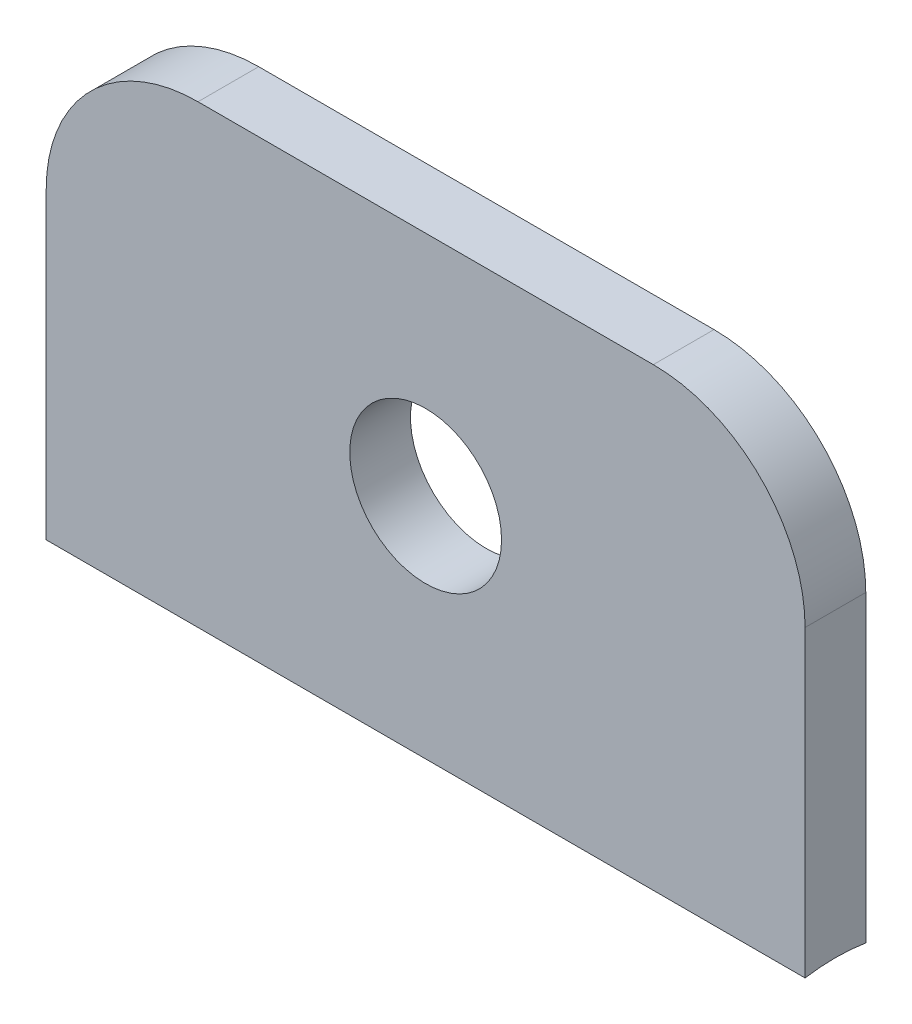
ISO-10303-21;
HEADER;
FILE_DESCRIPTION(('STEP AP214'),'2;1');
FILE_NAME('part.step','',(''),(''),'','','');
FILE_SCHEMA(('AUTOMOTIVE_DESIGN { 1 0 10303 214 1 1 1 1 }'));
ENDSEC;
DATA;
#1=APPLICATION_CONTEXT('core data for automotive mechanical design processes');
#2=APPLICATION_PROTOCOL_DEFINITION('international standard','automotive_design',2000,#1);
#3=PRODUCT_CONTEXT('',#1,'mechanical');
#4=PRODUCT('Part','Part','',(#3));
#5=PRODUCT_RELATED_PRODUCT_CATEGORY('part','',(#4));
#6=PRODUCT_DEFINITION_FORMATION('','',#4);
#7=PRODUCT_DEFINITION_CONTEXT('part definition',#1,'design');
#8=PRODUCT_DEFINITION('design','',#6,#7);
#9=PRODUCT_DEFINITION_SHAPE('','',#8);
#10=(LENGTH_UNIT() NAMED_UNIT(*) SI_UNIT(.MILLI.,.METRE.));
#11=(NAMED_UNIT(*) PLANE_ANGLE_UNIT() SI_UNIT($,.RADIAN.));
#12=(NAMED_UNIT(*) SI_UNIT($,.STERADIAN.) SOLID_ANGLE_UNIT());
#13=UNCERTAINTY_MEASURE_WITH_UNIT(LENGTH_MEASURE(1.E-05),#10,'distance_accuracy_value','');
#14=(GEOMETRIC_REPRESENTATION_CONTEXT(3) GLOBAL_UNCERTAINTY_ASSIGNED_CONTEXT((#13)) GLOBAL_UNIT_ASSIGNED_CONTEXT((#10,
#11,#12)) REPRESENTATION_CONTEXT('',''));
#15=CARTESIAN_POINT('',(0.,0.,0.));
#16=DIRECTION('',(0.,0.,1.));
#17=DIRECTION('',(1.,0.,0.));
#18=AXIS2_PLACEMENT_3D('',#15,#16,#17);
#19=CARTESIAN_POINT('',(-15.,5.,4.));
#20=DIRECTION('',(0.,0.,1.));
#21=DIRECTION('',(1.,0.,0.));
#22=AXIS2_PLACEMENT_3D('',#19,#20,#21);
#23=PLANE('',#22);
#24=DIRECTION('',(0.,1.,0.));
#25=VECTOR('',#24,1.);
#26=CARTESIAN_POINT('',(25.,4.99999999999993,4.));
#27=LINE('',#26,#25);
#28=CARTESIAN_POINT('',(25.,-15.,4.));
#29=VERTEX_POINT('',#28);
#30=CARTESIAN_POINT('',(25.,4.99999999999993,4.));
#31=VERTEX_POINT('',#30);
#32=EDGE_CURVE('E112',#29,#31,#27,.T.);
#33=ORIENTED_EDGE('',*,*,#32,.T.);
#34=CARTESIAN_POINT('',(15.,5.,4.));
#35=DIRECTION('',(0.,0.,1.));
#36=DIRECTION('',(-1.,0.,0.));
#37=AXIS2_PLACEMENT_3D('',#34,#35,#36);
#38=CIRCLE('',#37,10.);
#39=CARTESIAN_POINT('',(14.9999999999999,15.,4.));
#40=VERTEX_POINT('',#39);
#41=EDGE_CURVE('E91',#31,#40,#38,.T.);
#42=ORIENTED_EDGE('',*,*,#41,.T.);
#43=DIRECTION('',(-1.,0.,0.));
#44=VECTOR('',#43,1.);
#45=CARTESIAN_POINT('',(-14.9999999999999,15.,4.));
#46=LINE('',#45,#44);
#47=CARTESIAN_POINT('',(-14.9999999999999,15.,4.));
#48=VERTEX_POINT('',#47);
#49=EDGE_CURVE('E119',#40,#48,#46,.T.);
#50=ORIENTED_EDGE('',*,*,#49,.T.);
#51=CARTESIAN_POINT('',(-15.,5.,4.));
#52=DIRECTION('',(0.,0.,1.));
#53=DIRECTION('',(1.,0.,0.));
#54=AXIS2_PLACEMENT_3D('',#51,#52,#53);
#55=CIRCLE('',#54,10.);
#56=CARTESIAN_POINT('',(-25.,4.99999999999993,4.));
#57=VERTEX_POINT('',#56);
#58=EDGE_CURVE('E56',#48,#57,#55,.T.);
#59=ORIENTED_EDGE('',*,*,#58,.T.);
#60=DIRECTION('',(0.,-1.,0.));
#61=VECTOR('',#60,1.);
#62=CARTESIAN_POINT('',(-25.,4.99999999999993,4.));
#63=LINE('',#62,#61);
#64=CARTESIAN_POINT('',(-25.,-15.,4.));
#65=VERTEX_POINT('',#64);
#66=EDGE_CURVE('E115',#57,#65,#63,.T.);
#67=ORIENTED_EDGE('',*,*,#66,.T.);
#68=DIRECTION('',(1.,0.,0.));
#69=VECTOR('',#68,1.);
#70=CARTESIAN_POINT('',(-25.,-15.,4.));
#71=LINE('',#70,#69);
#72=EDGE_CURVE('E103',#65,#29,#71,.T.);
#73=ORIENTED_EDGE('',*,*,#72,.T.);
#74=EDGE_LOOP('',(#33,#42,#50,#59,#67,#73));
#75=FACE_BOUND('',#74,.T.);
#76=CARTESIAN_POINT('',(0.,0.,4.));
#77=DIRECTION('',(0.,0.,1.));
#78=DIRECTION('',(1.,0.,0.));
#79=AXIS2_PLACEMENT_3D('',#76,#77,#78);
#80=CIRCLE('',#79,5.);
#81=CARTESIAN_POINT('',(5.,0.,4.));
#82=VERTEX_POINT('',#81);
#83=EDGE_CURVE('E133',#82,#82,#80,.T.);
#84=ORIENTED_EDGE('',*,*,#83,.F.);
#85=EDGE_LOOP('',(#84));
#86=FACE_BOUND('',#85,.T.);
#87=ADVANCED_FACE('F39',(#75,#86),#23,.T.);
#88=CARTESIAN_POINT('',(-15.,5.,0.));
#89=DIRECTION('',(0.,0.,1.));
#90=DIRECTION('',(1.,0.,0.));
#91=AXIS2_PLACEMENT_3D('',#88,#89,#90);
#92=PLANE('',#91);
#93=DIRECTION('',(0.,1.,0.));
#94=VECTOR('',#93,1.);
#95=CARTESIAN_POINT('',(25.,4.99999999999993,0.));
#96=LINE('',#95,#94);
#97=CARTESIAN_POINT('',(25.,-15.,0.));
#98=VERTEX_POINT('',#97);
#99=CARTESIAN_POINT('',(25.,4.99999999999993,0.));
#100=VERTEX_POINT('',#99);
#101=EDGE_CURVE('E130',#98,#100,#96,.T.);
#102=ORIENTED_EDGE('',*,*,#101,.F.);
#103=DIRECTION('',(1.,0.,0.));
#104=VECTOR('',#103,1.);
#105=CARTESIAN_POINT('',(-25.,-15.,0.));
#106=LINE('',#105,#104);
#107=CARTESIAN_POINT('',(-25.,-15.,0.));
#108=VERTEX_POINT('',#107);
#109=EDGE_CURVE('E105',#108,#98,#106,.T.);
#110=ORIENTED_EDGE('',*,*,#109,.F.);
#111=DIRECTION('',(0.,-1.,0.));
#112=VECTOR('',#111,1.);
#113=CARTESIAN_POINT('',(-25.,4.99999999999993,0.));
#114=LINE('',#113,#112);
#115=CARTESIAN_POINT('',(-25.,4.99999999999993,0.));
#116=VERTEX_POINT('',#115);
#117=EDGE_CURVE('E121',#116,#108,#114,.T.);
#118=ORIENTED_EDGE('',*,*,#117,.F.);
#119=CARTESIAN_POINT('',(-15.,5.,0.));
#120=DIRECTION('',(0.,0.,1.));
#121=DIRECTION('',(1.,0.,0.));
#122=AXIS2_PLACEMENT_3D('',#119,#120,#121);
#123=CIRCLE('',#122,10.);
#124=CARTESIAN_POINT('',(-14.9999999999999,15.,0.));
#125=VERTEX_POINT('',#124);
#126=EDGE_CURVE('E76',#125,#116,#123,.T.);
#127=ORIENTED_EDGE('',*,*,#126,.F.);
#128=DIRECTION('',(-1.,0.,0.));
#129=VECTOR('',#128,1.);
#130=CARTESIAN_POINT('',(-14.9999999999999,15.,0.));
#131=LINE('',#130,#129);
#132=CARTESIAN_POINT('',(14.9999999999999,15.,0.));
#133=VERTEX_POINT('',#132);
#134=EDGE_CURVE('E135',#133,#125,#131,.T.);
#135=ORIENTED_EDGE('',*,*,#134,.F.);
#136=CARTESIAN_POINT('',(15.,5.,0.));
#137=DIRECTION('',(0.,0.,1.));
#138=DIRECTION('',(-1.,0.,0.));
#139=AXIS2_PLACEMENT_3D('',#136,#137,#138);
#140=CIRCLE('',#139,10.);
#141=EDGE_CURVE('E132',#100,#133,#140,.T.);
#142=ORIENTED_EDGE('',*,*,#141,.F.);
#143=EDGE_LOOP('',(#102,#110,#118,#127,#135,#142));
#144=FACE_BOUND('',#143,.T.);
#145=CARTESIAN_POINT('',(0.,0.,0.));
#146=DIRECTION('',(0.,0.,1.));
#147=DIRECTION('',(1.,0.,0.));
#148=AXIS2_PLACEMENT_3D('',#145,#146,#147);
#149=CIRCLE('',#148,5.);
#150=CARTESIAN_POINT('',(5.,0.,0.));
#151=VERTEX_POINT('',#150);
#152=EDGE_CURVE('E124',#151,#151,#149,.T.);
#153=ORIENTED_EDGE('',*,*,#152,.T.);
#154=EDGE_LOOP('',(#153));
#155=FACE_BOUND('',#154,.T.);
#156=ADVANCED_FACE('F148',(#144,#155),#92,.F.);
#157=CARTESIAN_POINT('',(25.,4.99999999999993,4.));
#158=DIRECTION('',(-1.,0.,0.));
#159=DIRECTION('',(0.,-1.,0.));
#160=AXIS2_PLACEMENT_3D('',#157,#158,#159);
#161=PLANE('',#160);
#162=ORIENTED_EDGE('',*,*,#32,.F.);
#163=CARTESIAN_POINT('',(25.,-27.5415310070182,2.));
#164=DIRECTION('',(1.,0.,0.));
#165=DIRECTION('',(0.,-1.,0.));
#166=AXIS2_PLACEMENT_3D('',#163,#164,#165);
#167=CIRCLE('',#166,12.7);
#168=EDGE_CURVE('E100',#98,#29,#167,.T.);
#169=ORIENTED_EDGE('',*,*,#168,.F.);
#170=ORIENTED_EDGE('',*,*,#101,.T.);
#171=DIRECTION('',(0.,0.,-1.));
#172=VECTOR('',#171,1.);
#173=CARTESIAN_POINT('',(25.,4.99999999999993,4.));
#174=LINE('',#173,#172);
#175=EDGE_CURVE('E11',#31,#100,#174,.T.);
#176=ORIENTED_EDGE('',*,*,#175,.F.);
#177=EDGE_LOOP('',(#162,#169,#170,#176));
#178=FACE_BOUND('',#177,.T.);
#179=ADVANCED_FACE('F41',(#178),#161,.F.);
#180=CARTESIAN_POINT('',(15.,5.,4.));
#181=DIRECTION('',(0.,0.,-1.));
#182=DIRECTION('',(-1.,0.,0.));
#183=AXIS2_PLACEMENT_3D('',#180,#181,#182);
#184=CYLINDRICAL_SURFACE('',#183,10.);
#185=ORIENTED_EDGE('',*,*,#141,.T.);
#186=DIRECTION('',(0.,0.,-1.));
#187=VECTOR('',#186,1.);
#188=CARTESIAN_POINT('',(14.9999999999999,15.,4.));
#189=LINE('',#188,#187);
#190=EDGE_CURVE('E48',#40,#133,#189,.T.);
#191=ORIENTED_EDGE('',*,*,#190,.F.);
#192=ORIENTED_EDGE('',*,*,#41,.F.);
#193=ORIENTED_EDGE('',*,*,#175,.T.);
#194=EDGE_LOOP('',(#185,#191,#192,#193));
#195=FACE_BOUND('',#194,.T.);
#196=ADVANCED_FACE('F162',(#195),#184,.T.);
#197=CARTESIAN_POINT('',(-14.9999999999999,15.,4.));
#198=DIRECTION('',(0.,-1.,0.));
#199=DIRECTION('',(0.,0.,-1.));
#200=AXIS2_PLACEMENT_3D('',#197,#198,#199);
#201=PLANE('',#200);
#202=ORIENTED_EDGE('',*,*,#134,.T.);
#203=DIRECTION('',(0.,0.,-1.));
#204=VECTOR('',#203,1.);
#205=CARTESIAN_POINT('',(-14.9999999999999,15.,4.));
#206=LINE('',#205,#204);
#207=EDGE_CURVE('E140',#48,#125,#206,.T.);
#208=ORIENTED_EDGE('',*,*,#207,.F.);
#209=ORIENTED_EDGE('',*,*,#49,.F.);
#210=ORIENTED_EDGE('',*,*,#190,.T.);
#211=EDGE_LOOP('',(#202,#208,#209,#210));
#212=FACE_BOUND('',#211,.T.);
#213=ADVANCED_FACE('F145',(#212),#201,.F.);
#214=CARTESIAN_POINT('',(-15.,5.,4.));
#215=DIRECTION('',(0.,0.,-1.));
#216=DIRECTION('',(-1.,0.,0.));
#217=AXIS2_PLACEMENT_3D('',#214,#215,#216);
#218=CYLINDRICAL_SURFACE('',#217,10.);
#219=ORIENTED_EDGE('',*,*,#126,.T.);
#220=DIRECTION('',(0.,0.,-1.));
#221=VECTOR('',#220,1.);
#222=CARTESIAN_POINT('',(-25.,4.99999999999993,4.));
#223=LINE('',#222,#221);
#224=EDGE_CURVE('E116',#57,#116,#223,.T.);
#225=ORIENTED_EDGE('',*,*,#224,.F.);
#226=ORIENTED_EDGE('',*,*,#58,.F.);
#227=ORIENTED_EDGE('',*,*,#207,.T.);
#228=EDGE_LOOP('',(#219,#225,#226,#227));
#229=FACE_BOUND('',#228,.T.);
#230=ADVANCED_FACE('F153',(#229),#218,.T.);
#231=CARTESIAN_POINT('',(-25.,4.99999999999993,4.));
#232=DIRECTION('',(1.,0.,0.));
#233=DIRECTION('',(0.,1.,0.));
#234=AXIS2_PLACEMENT_3D('',#231,#232,#233);
#235=PLANE('',#234);
#236=ORIENTED_EDGE('',*,*,#117,.T.);
#237=CARTESIAN_POINT('',(-25.,-27.5415310070183,2.));
#238=DIRECTION('',(1.,0.,0.));
#239=DIRECTION('',(0.,1.,0.));
#240=AXIS2_PLACEMENT_3D('',#237,#238,#239);
#241=CIRCLE('',#240,12.7);
#242=EDGE_CURVE('E84',#108,#65,#241,.T.);
#243=ORIENTED_EDGE('',*,*,#242,.T.);
#244=ORIENTED_EDGE('',*,*,#66,.F.);
#245=ORIENTED_EDGE('',*,*,#224,.T.);
#246=EDGE_LOOP('',(#236,#243,#244,#245));
#247=FACE_BOUND('',#246,.T.);
#248=ADVANCED_FACE('F152',(#247),#235,.F.);
#249=CARTESIAN_POINT('',(0.,0.,4.));
#250=DIRECTION('',(0.,0.,-1.));
#251=DIRECTION('',(-1.,0.,0.));
#252=AXIS2_PLACEMENT_3D('',#249,#250,#251);
#253=CYLINDRICAL_SURFACE('',#252,5.);
#254=ORIENTED_EDGE('',*,*,#83,.T.);
#255=EDGE_LOOP('',(#254));
#256=FACE_BOUND('',#255,.T.);
#257=ORIENTED_EDGE('',*,*,#152,.F.);
#258=EDGE_LOOP('',(#257));
#259=FACE_BOUND('',#258,.T.);
#260=ADVANCED_FACE('F160',(#256,#259),#253,.F.);
#261=CARTESIAN_POINT('',(-26.,-27.5415310070183,2.));
#262=DIRECTION('',(1.,0.,0.));
#263=DIRECTION('',(0.,1.,0.));
#264=AXIS2_PLACEMENT_3D('',#261,#262,#263);
#265=CYLINDRICAL_SURFACE('',#264,12.7);
#266=ORIENTED_EDGE('',*,*,#109,.T.);
#267=ORIENTED_EDGE('',*,*,#168,.T.);
#268=ORIENTED_EDGE('',*,*,#72,.F.);
#269=ORIENTED_EDGE('',*,*,#242,.F.);
#270=EDGE_LOOP('',(#266,#267,#268,#269));
#271=FACE_BOUND('',#270,.T.);
#272=ADVANCED_FACE('F102',(#271),#265,.F.);
#273=CLOSED_SHELL('',(#87,#156,#179,#196,#213,#230,#248,#260,#272));
#274=MANIFOLD_SOLID_BREP('B2',#273);
#275=ADVANCED_BREP_SHAPE_REPRESENTATION('',(#18,#274),#14);
#276=SHAPE_DEFINITION_REPRESENTATION(#9,#275);
ENDSEC;
END-ISO-10303-21;
